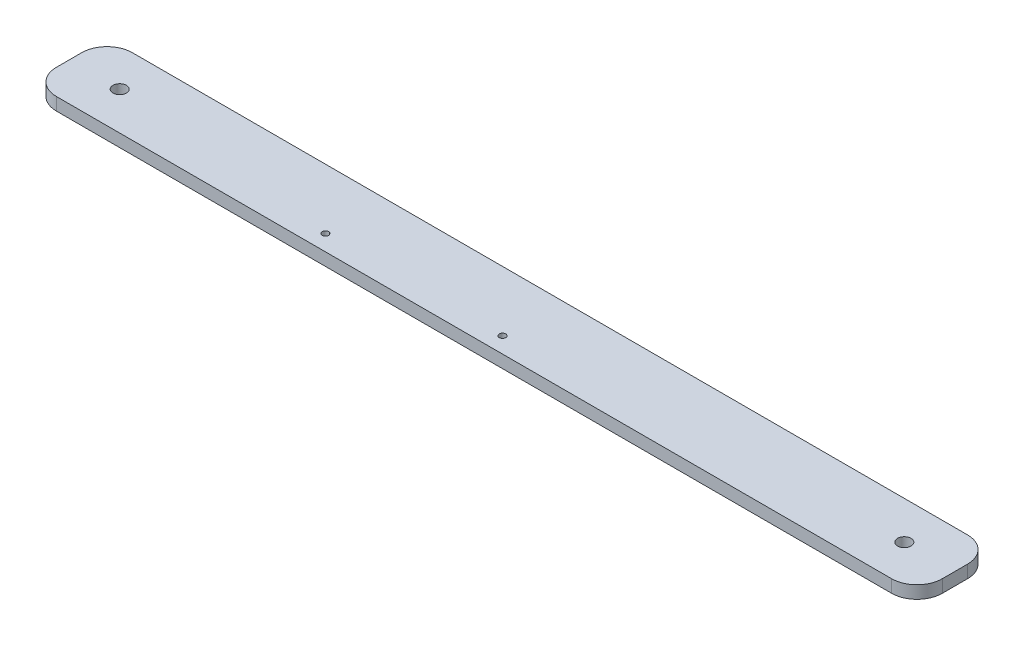
ISO-10303-21;
HEADER;
FILE_DESCRIPTION(('STEP AP214'),'2;1');
FILE_NAME('part.step','',(''),(''),'','','');
FILE_SCHEMA(('AUTOMOTIVE_DESIGN { 1 0 10303 214 1 1 1 1 }'));
ENDSEC;
DATA;
#1=APPLICATION_CONTEXT('core data for automotive mechanical design processes');
#2=APPLICATION_PROTOCOL_DEFINITION('international standard','automotive_design',2000,#1);
#3=PRODUCT_CONTEXT('',#1,'mechanical');
#4=PRODUCT('Part','Part','',(#3));
#5=PRODUCT_RELATED_PRODUCT_CATEGORY('part','',(#4));
#6=PRODUCT_DEFINITION_FORMATION('','',#4);
#7=PRODUCT_DEFINITION_CONTEXT('part definition',#1,'design');
#8=PRODUCT_DEFINITION('design','',#6,#7);
#9=PRODUCT_DEFINITION_SHAPE('','',#8);
#10=(LENGTH_UNIT() NAMED_UNIT(*) SI_UNIT(.MILLI.,.METRE.));
#11=(NAMED_UNIT(*) PLANE_ANGLE_UNIT() SI_UNIT($,.RADIAN.));
#12=(NAMED_UNIT(*) SI_UNIT($,.STERADIAN.) SOLID_ANGLE_UNIT());
#13=UNCERTAINTY_MEASURE_WITH_UNIT(LENGTH_MEASURE(1.E-05),#10,'distance_accuracy_value','');
#14=(GEOMETRIC_REPRESENTATION_CONTEXT(3) GLOBAL_UNCERTAINTY_ASSIGNED_CONTEXT((#13)) GLOBAL_UNIT_ASSIGNED_CONTEXT((#10,
#11,#12)) REPRESENTATION_CONTEXT('',''));
#15=CARTESIAN_POINT('',(0.,0.,0.));
#16=DIRECTION('',(0.,0.,1.));
#17=DIRECTION('',(1.,0.,0.));
#18=AXIS2_PLACEMENT_3D('',#15,#16,#17);
#19=CARTESIAN_POINT('',(431.8,6.35,-12.7));
#20=DIRECTION('',(0.,-1.,0.));
#21=DIRECTION('',(0.,0.,-1.));
#22=AXIS2_PLACEMENT_3D('',#19,#20,#21);
#23=CYLINDRICAL_SURFACE('',#22,12.7);
#24=DIRECTION('',(0.,-1.,0.));
#25=VECTOR('',#24,1.);
#26=CARTESIAN_POINT('',(444.5,6.35,-12.7));
#27=LINE('',#26,#25);
#28=CARTESIAN_POINT('',(444.5,6.35,-12.7));
#29=VERTEX_POINT('',#28);
#30=CARTESIAN_POINT('',(444.5,0.,-12.7));
#31=VERTEX_POINT('',#30);
#32=EDGE_CURVE('E180',#29,#31,#27,.T.);
#33=ORIENTED_EDGE('',*,*,#32,.F.);
#34=CARTESIAN_POINT('',(431.8,6.35,-12.7));
#35=DIRECTION('',(0.,-1.,0.));
#36=DIRECTION('',(0.,0.,-1.));
#37=AXIS2_PLACEMENT_3D('',#34,#35,#36);
#38=CIRCLE('',#37,12.7);
#39=CARTESIAN_POINT('',(431.8,6.35,0.));
#40=VERTEX_POINT('',#39);
#41=EDGE_CURVE('E48',#40,#29,#38,.F.);
#42=ORIENTED_EDGE('',*,*,#41,.F.);
#43=DIRECTION('',(0.,-1.,0.));
#44=VECTOR('',#43,1.);
#45=CARTESIAN_POINT('',(431.8,6.35,0.));
#46=LINE('',#45,#44);
#47=CARTESIAN_POINT('',(431.8,0.,0.));
#48=VERTEX_POINT('',#47);
#49=EDGE_CURVE('E183',#48,#40,#46,.F.);
#50=ORIENTED_EDGE('',*,*,#49,.F.);
#51=CARTESIAN_POINT('',(431.8,0.,-12.7));
#52=DIRECTION('',(0.,-1.,0.));
#53=DIRECTION('',(0.,0.,-1.));
#54=AXIS2_PLACEMENT_3D('',#51,#52,#53);
#55=CIRCLE('',#54,12.7);
#56=EDGE_CURVE('E11',#31,#48,#55,.T.);
#57=ORIENTED_EDGE('',*,*,#56,.F.);
#58=EDGE_LOOP('',(#33,#42,#50,#57));
#59=FACE_BOUND('',#58,.T.);
#60=ADVANCED_FACE('F41',(#59),#23,.T.);
#61=CARTESIAN_POINT('',(431.8,6.35,-25.4));
#62=DIRECTION('',(0.,-1.,0.));
#63=DIRECTION('',(0.,0.,-1.));
#64=AXIS2_PLACEMENT_3D('',#61,#62,#63);
#65=CYLINDRICAL_SURFACE('',#64,12.7);
#66=DIRECTION('',(0.,-1.,0.));
#67=VECTOR('',#66,1.);
#68=CARTESIAN_POINT('',(431.8,6.35,-38.1));
#69=LINE('',#68,#67);
#70=CARTESIAN_POINT('',(431.8,6.35,-38.1));
#71=VERTEX_POINT('',#70);
#72=CARTESIAN_POINT('',(431.8,0.,-38.1));
#73=VERTEX_POINT('',#72);
#74=EDGE_CURVE('E169',#71,#73,#69,.T.);
#75=ORIENTED_EDGE('',*,*,#74,.F.);
#76=CARTESIAN_POINT('',(431.8,6.35,-25.4));
#77=DIRECTION('',(0.,-1.,0.));
#78=DIRECTION('',(0.,0.,-1.));
#79=AXIS2_PLACEMENT_3D('',#76,#77,#78);
#80=CIRCLE('',#79,12.7);
#81=CARTESIAN_POINT('',(444.5,6.35,-25.4));
#82=VERTEX_POINT('',#81);
#83=EDGE_CURVE('E175',#82,#71,#80,.F.);
#84=ORIENTED_EDGE('',*,*,#83,.F.);
#85=DIRECTION('',(0.,-1.,0.));
#86=VECTOR('',#85,1.);
#87=CARTESIAN_POINT('',(444.5,6.35,-25.4));
#88=LINE('',#87,#86);
#89=CARTESIAN_POINT('',(444.5,0.,-25.4));
#90=VERTEX_POINT('',#89);
#91=EDGE_CURVE('E172',#90,#82,#88,.F.);
#92=ORIENTED_EDGE('',*,*,#91,.F.);
#93=CARTESIAN_POINT('',(431.8,0.,-25.4));
#94=DIRECTION('',(0.,-1.,0.));
#95=DIRECTION('',(0.,0.,-1.));
#96=AXIS2_PLACEMENT_3D('',#93,#94,#95);
#97=CIRCLE('',#96,12.7);
#98=EDGE_CURVE('E177',#73,#90,#97,.T.);
#99=ORIENTED_EDGE('',*,*,#98,.F.);
#100=EDGE_LOOP('',(#75,#84,#92,#99));
#101=FACE_BOUND('',#100,.T.);
#102=ADVANCED_FACE('F265',(#101),#65,.T.);
#103=CARTESIAN_POINT('',(12.7,6.35,-25.4));
#104=DIRECTION('',(0.,-1.,0.));
#105=DIRECTION('',(0.,0.,-1.));
#106=AXIS2_PLACEMENT_3D('',#103,#104,#105);
#107=CYLINDRICAL_SURFACE('',#106,12.7);
#108=DIRECTION('',(0.,-1.,0.));
#109=VECTOR('',#108,1.);
#110=CARTESIAN_POINT('',(0.,6.35,-25.4));
#111=LINE('',#110,#109);
#112=CARTESIAN_POINT('',(0.,6.35,-25.4));
#113=VERTEX_POINT('',#112);
#114=CARTESIAN_POINT('',(0.,0.,-25.4));
#115=VERTEX_POINT('',#114);
#116=EDGE_CURVE('E122',#113,#115,#111,.T.);
#117=ORIENTED_EDGE('',*,*,#116,.F.);
#118=CARTESIAN_POINT('',(12.7,6.35,-25.4));
#119=DIRECTION('',(0.,-1.,0.));
#120=DIRECTION('',(0.,0.,-1.));
#121=AXIS2_PLACEMENT_3D('',#118,#119,#120);
#122=CIRCLE('',#121,12.7);
#123=CARTESIAN_POINT('',(12.7,6.35,-38.1));
#124=VERTEX_POINT('',#123);
#125=EDGE_CURVE('E162',#124,#113,#122,.F.);
#126=ORIENTED_EDGE('',*,*,#125,.F.);
#127=DIRECTION('',(0.,-1.,0.));
#128=VECTOR('',#127,1.);
#129=CARTESIAN_POINT('',(12.7,6.35,-38.1));
#130=LINE('',#129,#128);
#131=CARTESIAN_POINT('',(12.7,0.,-38.1));
#132=VERTEX_POINT('',#131);
#133=EDGE_CURVE('E158',#132,#124,#130,.F.);
#134=ORIENTED_EDGE('',*,*,#133,.F.);
#135=CARTESIAN_POINT('',(12.7,0.,-25.4));
#136=DIRECTION('',(0.,-1.,0.));
#137=DIRECTION('',(0.,0.,-1.));
#138=AXIS2_PLACEMENT_3D('',#135,#136,#137);
#139=CIRCLE('',#138,12.7);
#140=EDGE_CURVE('E165',#115,#132,#139,.T.);
#141=ORIENTED_EDGE('',*,*,#140,.F.);
#142=EDGE_LOOP('',(#117,#126,#134,#141));
#143=FACE_BOUND('',#142,.T.);
#144=ADVANCED_FACE('F269',(#143),#107,.T.);
#145=CARTESIAN_POINT('',(12.7,6.35,-12.7));
#146=DIRECTION('',(0.,-1.,0.));
#147=DIRECTION('',(0.,0.,-1.));
#148=AXIS2_PLACEMENT_3D('',#145,#146,#147);
#149=CYLINDRICAL_SURFACE('',#148,12.7);
#150=DIRECTION('',(0.,-1.,0.));
#151=VECTOR('',#150,1.);
#152=CARTESIAN_POINT('',(12.7,6.35,0.));
#153=LINE('',#152,#151);
#154=CARTESIAN_POINT('',(12.7,6.35,0.));
#155=VERTEX_POINT('',#154);
#156=CARTESIAN_POINT('',(12.7,0.,0.));
#157=VERTEX_POINT('',#156);
#158=EDGE_CURVE('E116',#155,#157,#153,.T.);
#159=ORIENTED_EDGE('',*,*,#158,.F.);
#160=CARTESIAN_POINT('',(12.7,6.35,-12.7));
#161=DIRECTION('',(0.,-1.,0.));
#162=DIRECTION('',(0.,0.,-1.));
#163=AXIS2_PLACEMENT_3D('',#160,#161,#162);
#164=CIRCLE('',#163,12.7);
#165=CARTESIAN_POINT('',(0.,6.35,-12.7));
#166=VERTEX_POINT('',#165);
#167=EDGE_CURVE('E123',#166,#155,#164,.F.);
#168=ORIENTED_EDGE('',*,*,#167,.F.);
#169=DIRECTION('',(0.,-1.,0.));
#170=VECTOR('',#169,1.);
#171=CARTESIAN_POINT('',(0.,6.35,-12.7));
#172=LINE('',#171,#170);
#173=CARTESIAN_POINT('',(0.,0.,-12.7));
#174=VERTEX_POINT('',#173);
#175=EDGE_CURVE('E119',#174,#166,#172,.F.);
#176=ORIENTED_EDGE('',*,*,#175,.F.);
#177=CARTESIAN_POINT('',(12.7,0.,-12.7));
#178=DIRECTION('',(0.,-1.,0.));
#179=DIRECTION('',(0.,0.,-1.));
#180=AXIS2_PLACEMENT_3D('',#177,#178,#179);
#181=CIRCLE('',#180,12.7);
#182=EDGE_CURVE('E112',#157,#174,#181,.T.);
#183=ORIENTED_EDGE('',*,*,#182,.F.);
#184=EDGE_LOOP('',(#159,#168,#176,#183));
#185=FACE_BOUND('',#184,.T.);
#186=ADVANCED_FACE('F114',(#185),#149,.T.);
#187=CARTESIAN_POINT('',(0.,6.35,0.));
#188=DIRECTION('',(1.,0.,0.));
#189=DIRECTION('',(0.,0.,-1.));
#190=AXIS2_PLACEMENT_3D('',#187,#188,#189);
#191=PLANE('',#190);
#192=DIRECTION('',(0.,0.,1.));
#193=VECTOR('',#192,1.);
#194=CARTESIAN_POINT('',(0.,6.35,0.));
#195=LINE('',#194,#193);
#196=EDGE_CURVE('E149',#113,#166,#195,.T.);
#197=ORIENTED_EDGE('',*,*,#196,.F.);
#198=ORIENTED_EDGE('',*,*,#116,.T.);
#199=DIRECTION('',(0.,0.,1.));
#200=VECTOR('',#199,1.);
#201=CARTESIAN_POINT('',(0.,0.,0.));
#202=LINE('',#201,#200);
#203=EDGE_CURVE('E137',#115,#174,#202,.T.);
#204=ORIENTED_EDGE('',*,*,#203,.T.);
#205=ORIENTED_EDGE('',*,*,#175,.T.);
#206=EDGE_LOOP('',(#197,#198,#204,#205));
#207=FACE_BOUND('',#206,.T.);
#208=ADVANCED_FACE('F280',(#207),#191,.F.);
#209=CARTESIAN_POINT('',(0.,6.35,0.));
#210=DIRECTION('',(0.,0.,-1.));
#211=DIRECTION('',(-1.,0.,0.));
#212=AXIS2_PLACEMENT_3D('',#209,#210,#211);
#213=PLANE('',#212);
#214=DIRECTION('',(1.,0.,0.));
#215=VECTOR('',#214,1.);
#216=CARTESIAN_POINT('',(0.,0.,0.));
#217=LINE('',#216,#215);
#218=EDGE_CURVE('E128',#157,#48,#217,.T.);
#219=ORIENTED_EDGE('',*,*,#218,.T.);
#220=ORIENTED_EDGE('',*,*,#49,.T.);
#221=DIRECTION('',(1.,0.,0.));
#222=VECTOR('',#221,1.);
#223=CARTESIAN_POINT('',(0.,6.35,0.));
#224=LINE('',#223,#222);
#225=EDGE_CURVE('E130',#155,#40,#224,.T.);
#226=ORIENTED_EDGE('',*,*,#225,.F.);
#227=ORIENTED_EDGE('',*,*,#158,.T.);
#228=EDGE_LOOP('',(#219,#220,#226,#227));
#229=FACE_BOUND('',#228,.T.);
#230=ADVANCED_FACE('F127',(#229),#213,.F.);
#231=CARTESIAN_POINT('',(444.5,6.35,0.));
#232=DIRECTION('',(-1.,0.,0.));
#233=DIRECTION('',(0.,0.,1.));
#234=AXIS2_PLACEMENT_3D('',#231,#232,#233);
#235=PLANE('',#234);
#236=DIRECTION('',(0.,0.,-1.));
#237=VECTOR('',#236,1.);
#238=CARTESIAN_POINT('',(444.5,6.35,0.));
#239=LINE('',#238,#237);
#240=EDGE_CURVE('E187',#29,#82,#239,.T.);
#241=ORIENTED_EDGE('',*,*,#240,.F.);
#242=ORIENTED_EDGE('',*,*,#32,.T.);
#243=DIRECTION('',(0.,0.,-1.));
#244=VECTOR('',#243,1.);
#245=CARTESIAN_POINT('',(444.5,0.,0.));
#246=LINE('',#245,#244);
#247=EDGE_CURVE('E136',#31,#90,#246,.T.);
#248=ORIENTED_EDGE('',*,*,#247,.T.);
#249=ORIENTED_EDGE('',*,*,#91,.T.);
#250=EDGE_LOOP('',(#241,#242,#248,#249));
#251=FACE_BOUND('',#250,.T.);
#252=ADVANCED_FACE('F190',(#251),#235,.F.);
#253=CARTESIAN_POINT('',(0.,6.35,-38.1));
#254=DIRECTION('',(0.,0.,1.));
#255=DIRECTION('',(1.,0.,0.));
#256=AXIS2_PLACEMENT_3D('',#253,#254,#255);
#257=PLANE('',#256);
#258=DIRECTION('',(-1.,0.,0.));
#259=VECTOR('',#258,1.);
#260=CARTESIAN_POINT('',(0.,6.35,-38.1));
#261=LINE('',#260,#259);
#262=EDGE_CURVE('E132',#71,#124,#261,.T.);
#263=ORIENTED_EDGE('',*,*,#262,.F.);
#264=ORIENTED_EDGE('',*,*,#74,.T.);
#265=DIRECTION('',(-1.,0.,0.));
#266=VECTOR('',#265,1.);
#267=CARTESIAN_POINT('',(0.,0.,-38.1));
#268=LINE('',#267,#266);
#269=EDGE_CURVE('E141',#73,#132,#268,.T.);
#270=ORIENTED_EDGE('',*,*,#269,.T.);
#271=ORIENTED_EDGE('',*,*,#133,.T.);
#272=EDGE_LOOP('',(#263,#264,#270,#271));
#273=FACE_BOUND('',#272,.T.);
#274=ADVANCED_FACE('F254',(#273),#257,.F.);
#275=CARTESIAN_POINT('',(0.,6.35,0.));
#276=DIRECTION('',(0.,-1.,0.));
#277=DIRECTION('',(0.,0.,-1.));
#278=AXIS2_PLACEMENT_3D('',#275,#276,#277);
#279=PLANE('',#278);
#280=CARTESIAN_POINT('',(228.6,6.34999999999999,-7.9375));
#281=DIRECTION('',(0.,-1.,0.));
#282=DIRECTION('',(0.,0.,-1.));
#283=AXIS2_PLACEMENT_3D('',#280,#281,#282);
#284=CIRCLE('',#283,1.63194999999999);
#285=CARTESIAN_POINT('',(228.6,6.34999999999999,-9.56944999999999));
#286=VERTEX_POINT('',#285);
#287=EDGE_CURVE('E222',#286,#286,#284,.T.);
#288=ORIENTED_EDGE('',*,*,#287,.T.);
#289=EDGE_LOOP('',(#288));
#290=FACE_BOUND('',#289,.T.);
#291=CARTESIAN_POINT('',(139.7,6.34999999999999,-7.9375));
#292=DIRECTION('',(0.,-1.,0.));
#293=DIRECTION('',(0.,0.,-1.));
#294=AXIS2_PLACEMENT_3D('',#291,#292,#293);
#295=CIRCLE('',#294,1.63194999999999);
#296=CARTESIAN_POINT('',(139.7,6.34999999999999,-9.56944999999999));
#297=VERTEX_POINT('',#296);
#298=EDGE_CURVE('E209',#297,#297,#295,.T.);
#299=ORIENTED_EDGE('',*,*,#298,.T.);
#300=EDGE_LOOP('',(#299));
#301=FACE_BOUND('',#300,.T.);
#302=CARTESIAN_POINT('',(419.1,6.35,-19.05));
#303=DIRECTION('',(0.,1.,0.));
#304=DIRECTION('',(0.,0.,1.));
#305=AXIS2_PLACEMENT_3D('',#302,#303,#304);
#306=CIRCLE('',#305,3.37819999999999);
#307=CARTESIAN_POINT('',(419.1,6.35,-15.6718));
#308=VERTEX_POINT('',#307);
#309=EDGE_CURVE('E206',#308,#308,#306,.T.);
#310=ORIENTED_EDGE('',*,*,#309,.F.);
#311=EDGE_LOOP('',(#310));
#312=FACE_BOUND('',#311,.T.);
#313=CARTESIAN_POINT('',(25.4,6.35,-19.05));
#314=DIRECTION('',(0.,1.,0.));
#315=DIRECTION('',(0.,0.,1.));
#316=AXIS2_PLACEMENT_3D('',#313,#314,#315);
#317=CIRCLE('',#316,3.3782);
#318=CARTESIAN_POINT('',(25.4,6.35,-15.6718));
#319=VERTEX_POINT('',#318);
#320=EDGE_CURVE('E198',#319,#319,#317,.T.);
#321=ORIENTED_EDGE('',*,*,#320,.F.);
#322=EDGE_LOOP('',(#321));
#323=FACE_BOUND('',#322,.T.);
#324=ORIENTED_EDGE('',*,*,#225,.T.);
#325=ORIENTED_EDGE('',*,*,#41,.T.);
#326=ORIENTED_EDGE('',*,*,#240,.T.);
#327=ORIENTED_EDGE('',*,*,#83,.T.);
#328=ORIENTED_EDGE('',*,*,#262,.T.);
#329=ORIENTED_EDGE('',*,*,#125,.T.);
#330=ORIENTED_EDGE('',*,*,#196,.T.);
#331=ORIENTED_EDGE('',*,*,#167,.T.);
#332=EDGE_LOOP('',(#324,#325,#326,#327,#328,#329,#330,#331));
#333=FACE_BOUND('',#332,.T.);
#334=ADVANCED_FACE('F185',(#290,#301,#312,#323,#333),#279,.F.);
#335=CARTESIAN_POINT('',(0.,0.,0.));
#336=DIRECTION('',(0.,-1.,0.));
#337=DIRECTION('',(0.,0.,-1.));
#338=AXIS2_PLACEMENT_3D('',#335,#336,#337);
#339=PLANE('',#338);
#340=CARTESIAN_POINT('',(228.6,0.,-7.9375));
#341=DIRECTION('',(0.,-1.,0.));
#342=DIRECTION('',(0.,0.,-1.));
#343=AXIS2_PLACEMENT_3D('',#340,#341,#342);
#344=CIRCLE('',#343,2.85749999999998);
#345=CARTESIAN_POINT('',(228.6,0.,-10.795));
#346=VERTEX_POINT('',#345);
#347=EDGE_CURVE('E230',#346,#346,#344,.T.);
#348=ORIENTED_EDGE('',*,*,#347,.F.);
#349=EDGE_LOOP('',(#348));
#350=FACE_BOUND('',#349,.T.);
#351=CARTESIAN_POINT('',(139.7,0.,-7.9375));
#352=DIRECTION('',(0.,-1.,0.));
#353=DIRECTION('',(0.,0.,-1.));
#354=AXIS2_PLACEMENT_3D('',#351,#352,#353);
#355=CIRCLE('',#354,2.85750000000001);
#356=CARTESIAN_POINT('',(139.7,0.,-10.795));
#357=VERTEX_POINT('',#356);
#358=EDGE_CURVE('E218',#357,#357,#355,.T.);
#359=ORIENTED_EDGE('',*,*,#358,.F.);
#360=EDGE_LOOP('',(#359));
#361=FACE_BOUND('',#360,.T.);
#362=CARTESIAN_POINT('',(419.1,0.,-19.05));
#363=DIRECTION('',(0.,1.,0.));
#364=DIRECTION('',(0.,0.,1.));
#365=AXIS2_PLACEMENT_3D('',#362,#363,#364);
#366=CIRCLE('',#365,3.37819999999999);
#367=CARTESIAN_POINT('',(419.1,0.,-15.6718));
#368=VERTEX_POINT('',#367);
#369=EDGE_CURVE('E202',#368,#368,#366,.T.);
#370=ORIENTED_EDGE('',*,*,#369,.T.);
#371=EDGE_LOOP('',(#370));
#372=FACE_BOUND('',#371,.T.);
#373=CARTESIAN_POINT('',(25.4,0.,-19.05));
#374=DIRECTION('',(0.,1.,0.));
#375=DIRECTION('',(0.,0.,1.));
#376=AXIS2_PLACEMENT_3D('',#373,#374,#375);
#377=CIRCLE('',#376,3.3782);
#378=CARTESIAN_POINT('',(25.4,0.,-15.6718));
#379=VERTEX_POINT('',#378);
#380=EDGE_CURVE('E144',#379,#379,#377,.T.);
#381=ORIENTED_EDGE('',*,*,#380,.T.);
#382=EDGE_LOOP('',(#381));
#383=FACE_BOUND('',#382,.T.);
#384=ORIENTED_EDGE('',*,*,#247,.F.);
#385=ORIENTED_EDGE('',*,*,#56,.T.);
#386=ORIENTED_EDGE('',*,*,#218,.F.);
#387=ORIENTED_EDGE('',*,*,#182,.T.);
#388=ORIENTED_EDGE('',*,*,#203,.F.);
#389=ORIENTED_EDGE('',*,*,#140,.T.);
#390=ORIENTED_EDGE('',*,*,#269,.F.);
#391=ORIENTED_EDGE('',*,*,#98,.T.);
#392=EDGE_LOOP('',(#384,#385,#386,#387,#388,#389,#390,#391));
#393=FACE_BOUND('',#392,.T.);
#394=ADVANCED_FACE('F134',(#350,#361,#372,#383,#393),#339,.T.);
#395=CARTESIAN_POINT('',(25.4,0.,-19.05));
#396=DIRECTION('',(0.,1.,0.));
#397=DIRECTION('',(0.,0.,1.));
#398=AXIS2_PLACEMENT_3D('',#395,#396,#397);
#399=CYLINDRICAL_SURFACE('',#398,3.3782);
#400=ORIENTED_EDGE('',*,*,#380,.F.);
#401=EDGE_LOOP('',(#400));
#402=FACE_BOUND('',#401,.T.);
#403=ORIENTED_EDGE('',*,*,#320,.T.);
#404=EDGE_LOOP('',(#403));
#405=FACE_BOUND('',#404,.T.);
#406=ADVANCED_FACE('F239',(#402,#405),#399,.F.);
#407=CARTESIAN_POINT('',(419.1,0.,-19.05));
#408=DIRECTION('',(0.,1.,0.));
#409=DIRECTION('',(0.,0.,1.));
#410=AXIS2_PLACEMENT_3D('',#407,#408,#409);
#411=CYLINDRICAL_SURFACE('',#410,3.37819999999999);
#412=ORIENTED_EDGE('',*,*,#369,.F.);
#413=EDGE_LOOP('',(#412));
#414=FACE_BOUND('',#413,.T.);
#415=ORIENTED_EDGE('',*,*,#309,.T.);
#416=EDGE_LOOP('',(#415));
#417=FACE_BOUND('',#416,.T.);
#418=ADVANCED_FACE('F249',(#414,#417),#411,.F.);
#419=CARTESIAN_POINT('',(139.7,0.,-7.9375));
#420=DIRECTION('',(0.,-1.,0.));
#421=DIRECTION('',(0.,0.,-1.));
#422=AXIS2_PLACEMENT_3D('',#419,#420,#421);
#423=CYLINDRICAL_SURFACE('',#422,1.63194999999999);
#424=ORIENTED_EDGE('',*,*,#298,.F.);
#425=EDGE_LOOP('',(#424));
#426=FACE_BOUND('',#425,.T.);
#427=CARTESIAN_POINT('',(139.7,1.40983400146974,-7.9375));
#428=DIRECTION('',(0.,-1.,0.));
#429=DIRECTION('',(0.,0.,-1.));
#430=AXIS2_PLACEMENT_3D('',#427,#428,#429);
#431=CIRCLE('',#430,1.63194999999999);
#432=CARTESIAN_POINT('',(139.7,1.40983400146974,-9.56944999999999));
#433=VERTEX_POINT('',#432);
#434=EDGE_CURVE('E214',#433,#433,#431,.T.);
#435=ORIENTED_EDGE('',*,*,#434,.T.);
#436=EDGE_LOOP('',(#435));
#437=FACE_BOUND('',#436,.T.);
#438=ADVANCED_FACE('F316',(#426,#437),#423,.F.);
#439=CARTESIAN_POINT('',(139.7,0.,-7.9375));
#440=DIRECTION('',(0.,-1.,0.));
#441=DIRECTION('',(0.,0.,-1.));
#442=AXIS2_PLACEMENT_3D('',#439,#440,#441);
#443=CONICAL_SURFACE('',#442,2.85750000000001,0.715584993317671);
#444=ORIENTED_EDGE('',*,*,#434,.F.);
#445=EDGE_LOOP('',(#444));
#446=FACE_BOUND('',#445,.T.);
#447=ORIENTED_EDGE('',*,*,#358,.T.);
#448=EDGE_LOOP('',(#447));
#449=FACE_BOUND('',#448,.T.);
#450=ADVANCED_FACE('F323',(#446,#449),#443,.F.);
#451=CARTESIAN_POINT('',(228.6,0.,-7.9375));
#452=DIRECTION('',(0.,-1.,0.));
#453=DIRECTION('',(0.,0.,-1.));
#454=AXIS2_PLACEMENT_3D('',#451,#452,#453);
#455=CYLINDRICAL_SURFACE('',#454,1.63194999999999);
#456=ORIENTED_EDGE('',*,*,#287,.F.);
#457=EDGE_LOOP('',(#456));
#458=FACE_BOUND('',#457,.T.);
#459=CARTESIAN_POINT('',(228.6,1.40983400146974,-7.9375));
#460=DIRECTION('',(0.,-1.,0.));
#461=DIRECTION('',(0.,0.,-1.));
#462=AXIS2_PLACEMENT_3D('',#459,#460,#461);
#463=CIRCLE('',#462,1.63194999999999);
#464=CARTESIAN_POINT('',(228.6,1.40983400146974,-9.56944999999999));
#465=VERTEX_POINT('',#464);
#466=EDGE_CURVE('E226',#465,#465,#463,.T.);
#467=ORIENTED_EDGE('',*,*,#466,.T.);
#468=EDGE_LOOP('',(#467));
#469=FACE_BOUND('',#468,.T.);
#470=ADVANCED_FACE('F331',(#458,#469),#455,.F.);
#471=CARTESIAN_POINT('',(228.6,0.,-7.9375));
#472=DIRECTION('',(0.,-1.,0.));
#473=DIRECTION('',(0.,0.,-1.));
#474=AXIS2_PLACEMENT_3D('',#471,#472,#473);
#475=CONICAL_SURFACE('',#474,2.85749999999998,0.71558499331766);
#476=ORIENTED_EDGE('',*,*,#466,.F.);
#477=EDGE_LOOP('',(#476));
#478=FACE_BOUND('',#477,.T.);
#479=ORIENTED_EDGE('',*,*,#347,.T.);
#480=EDGE_LOOP('',(#479));
#481=FACE_BOUND('',#480,.T.);
#482=ADVANCED_FACE('F235',(#478,#481),#475,.F.);
#483=CLOSED_SHELL('',(#60,#102,#144,#186,#208,#230,#252,#274,#334,#394,#406,#418,#438,#450,#470,#482));
#484=MANIFOLD_SOLID_BREP('B2',#483);
#485=ADVANCED_BREP_SHAPE_REPRESENTATION('',(#18,#484),#14);
#486=SHAPE_DEFINITION_REPRESENTATION(#9,#485);
ENDSEC;
END-ISO-10303-21;
